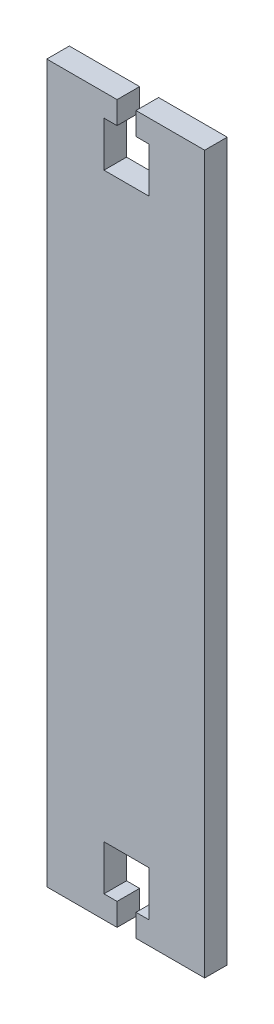
ISO-10303-21;
HEADER;
FILE_DESCRIPTION(('STEP AP214'),'2;1');
FILE_NAME('part.step','',(''),(''),'','','');
FILE_SCHEMA(('AUTOMOTIVE_DESIGN { 1 0 10303 214 1 1 1 1 }'));
ENDSEC;
DATA;
#1=APPLICATION_CONTEXT('core data for automotive mechanical design processes');
#2=APPLICATION_PROTOCOL_DEFINITION('international standard','automotive_design',2000,#1);
#3=PRODUCT_CONTEXT('',#1,'mechanical');
#4=PRODUCT('Part','Part','',(#3));
#5=PRODUCT_RELATED_PRODUCT_CATEGORY('part','',(#4));
#6=PRODUCT_DEFINITION_FORMATION('','',#4);
#7=PRODUCT_DEFINITION_CONTEXT('part definition',#1,'design');
#8=PRODUCT_DEFINITION('design','',#6,#7);
#9=PRODUCT_DEFINITION_SHAPE('','',#8);
#10=(LENGTH_UNIT() NAMED_UNIT(*) SI_UNIT(.MILLI.,.METRE.));
#11=(NAMED_UNIT(*) PLANE_ANGLE_UNIT() SI_UNIT($,.RADIAN.));
#12=(NAMED_UNIT(*) SI_UNIT($,.STERADIAN.) SOLID_ANGLE_UNIT());
#13=UNCERTAINTY_MEASURE_WITH_UNIT(LENGTH_MEASURE(1.E-05),#10,'distance_accuracy_value','');
#14=(GEOMETRIC_REPRESENTATION_CONTEXT(3) GLOBAL_UNCERTAINTY_ASSIGNED_CONTEXT((#13)) GLOBAL_UNIT_ASSIGNED_CONTEXT((#10,
#11,#12)) REPRESENTATION_CONTEXT('',''));
#15=CARTESIAN_POINT('',(0.,0.,0.));
#16=DIRECTION('',(0.,0.,1.));
#17=DIRECTION('',(1.,0.,0.));
#18=AXIS2_PLACEMENT_3D('',#15,#16,#17);
#19=CARTESIAN_POINT('',(0.,0.,5.));
#20=DIRECTION('',(1.,0.,0.));
#21=DIRECTION('',(0.,0.,-1.));
#22=AXIS2_PLACEMENT_3D('',#19,#20,#21);
#23=PLANE('',#22);
#24=DIRECTION('',(0.,-1.,0.));
#25=VECTOR('',#24,1.);
#26=CARTESIAN_POINT('',(0.,0.,0.));
#27=LINE('',#26,#25);
#28=CARTESIAN_POINT('',(0.,158.92,0.));
#29=VERTEX_POINT('',#28);
#30=CARTESIAN_POINT('',(0.,0.,0.));
#31=VERTEX_POINT('',#30);
#32=EDGE_CURVE('E208',#29,#31,#27,.T.);
#33=ORIENTED_EDGE('',*,*,#32,.T.);
#34=DIRECTION('',(0.,0.,-1.));
#35=VECTOR('',#34,1.);
#36=CARTESIAN_POINT('',(0.,0.,5.));
#37=LINE('',#36,#35);
#38=CARTESIAN_POINT('',(0.,0.,5.));
#39=VERTEX_POINT('',#38);
#40=EDGE_CURVE('E11',#39,#31,#37,.T.);
#41=ORIENTED_EDGE('',*,*,#40,.F.);
#42=DIRECTION('',(0.,-1.,0.));
#43=VECTOR('',#42,1.);
#44=CARTESIAN_POINT('',(0.,0.,5.));
#45=LINE('',#44,#43);
#46=CARTESIAN_POINT('',(0.,158.92,5.));
#47=VERTEX_POINT('',#46);
#48=EDGE_CURVE('E246',#47,#39,#45,.T.);
#49=ORIENTED_EDGE('',*,*,#48,.F.);
#50=DIRECTION('',(0.,0.,-1.));
#51=VECTOR('',#50,1.);
#52=CARTESIAN_POINT('',(0.,158.92,5.));
#53=LINE('',#52,#51);
#54=EDGE_CURVE('E204',#47,#29,#53,.T.);
#55=ORIENTED_EDGE('',*,*,#54,.T.);
#56=EDGE_LOOP('',(#33,#41,#49,#55));
#57=FACE_BOUND('',#56,.T.);
#58=ADVANCED_FACE('F40',(#57),#23,.F.);
#59=CARTESIAN_POINT('',(0.,0.,5.));
#60=DIRECTION('',(0.,1.,0.));
#61=DIRECTION('',(-1.,0.,0.));
#62=AXIS2_PLACEMENT_3D('',#59,#60,#61);
#63=PLANE('',#62);
#64=DIRECTION('',(1.,0.,0.));
#65=VECTOR('',#64,1.);
#66=CARTESIAN_POINT('',(0.,0.,0.));
#67=LINE('',#66,#65);
#68=CARTESIAN_POINT('',(15.58,0.,0.));
#69=VERTEX_POINT('',#68);
#70=EDGE_CURVE('E211',#31,#69,#67,.T.);
#71=ORIENTED_EDGE('',*,*,#70,.T.);
#72=DIRECTION('',(0.,0.,-1.));
#73=VECTOR('',#72,1.);
#74=CARTESIAN_POINT('',(15.58,0.,5.));
#75=LINE('',#74,#73);
#76=CARTESIAN_POINT('',(15.58,0.,5.));
#77=VERTEX_POINT('',#76);
#78=EDGE_CURVE('E48',#77,#69,#75,.T.);
#79=ORIENTED_EDGE('',*,*,#78,.F.);
#80=DIRECTION('',(1.,0.,0.));
#81=VECTOR('',#80,1.);
#82=CARTESIAN_POINT('',(0.,0.,5.));
#83=LINE('',#82,#81);
#84=EDGE_CURVE('E135',#39,#77,#83,.T.);
#85=ORIENTED_EDGE('',*,*,#84,.F.);
#86=ORIENTED_EDGE('',*,*,#40,.T.);
#87=EDGE_LOOP('',(#71,#79,#85,#86));
#88=FACE_BOUND('',#87,.T.);
#89=ADVANCED_FACE('F364',(#88),#63,.F.);
#90=CARTESIAN_POINT('',(15.58,0.,5.));
#91=DIRECTION('',(-1.,0.,0.));
#92=DIRECTION('',(0.,-1.,0.));
#93=AXIS2_PLACEMENT_3D('',#90,#91,#92);
#94=PLANE('',#93);
#95=DIRECTION('',(0.,1.,0.));
#96=VECTOR('',#95,1.);
#97=CARTESIAN_POINT('',(15.58,0.,0.));
#98=LINE('',#97,#96);
#99=CARTESIAN_POINT('',(15.58,5.,0.));
#100=VERTEX_POINT('',#99);
#101=EDGE_CURVE('E213',#69,#100,#98,.T.);
#102=ORIENTED_EDGE('',*,*,#101,.T.);
#103=DIRECTION('',(0.,0.,-1.));
#104=VECTOR('',#103,1.);
#105=CARTESIAN_POINT('',(15.58,5.,5.));
#106=LINE('',#105,#104);
#107=CARTESIAN_POINT('',(15.58,5.,5.));
#108=VERTEX_POINT('',#107);
#109=EDGE_CURVE('E289',#108,#100,#106,.T.);
#110=ORIENTED_EDGE('',*,*,#109,.F.);
#111=DIRECTION('',(0.,1.,0.));
#112=VECTOR('',#111,1.);
#113=CARTESIAN_POINT('',(15.58,0.,5.));
#114=LINE('',#113,#112);
#115=EDGE_CURVE('E297',#77,#108,#114,.T.);
#116=ORIENTED_EDGE('',*,*,#115,.F.);
#117=ORIENTED_EDGE('',*,*,#78,.T.);
#118=EDGE_LOOP('',(#102,#110,#116,#117));
#119=FACE_BOUND('',#118,.T.);
#120=ADVANCED_FACE('F295',(#119),#94,.F.);
#121=CARTESIAN_POINT('',(15.58,5.,5.));
#122=DIRECTION('',(0.,-1.,0.));
#123=DIRECTION('',(0.,0.,-1.));
#124=AXIS2_PLACEMENT_3D('',#121,#122,#123);
#125=PLANE('',#124);
#126=DIRECTION('',(-1.,0.,0.));
#127=VECTOR('',#126,1.);
#128=CARTESIAN_POINT('',(15.58,5.,0.));
#129=LINE('',#128,#127);
#130=CARTESIAN_POINT('',(12.68,5.,0.));
#131=VERTEX_POINT('',#130);
#132=EDGE_CURVE('E215',#100,#131,#129,.T.);
#133=ORIENTED_EDGE('',*,*,#132,.T.);
#134=DIRECTION('',(0.,0.,-1.));
#135=VECTOR('',#134,1.);
#136=CARTESIAN_POINT('',(12.68,5.,5.));
#137=LINE('',#136,#135);
#138=CARTESIAN_POINT('',(12.68,5.,5.));
#139=VERTEX_POINT('',#138);
#140=EDGE_CURVE('E286',#139,#131,#137,.T.);
#141=ORIENTED_EDGE('',*,*,#140,.F.);
#142=DIRECTION('',(-1.,0.,0.));
#143=VECTOR('',#142,1.);
#144=CARTESIAN_POINT('',(15.58,5.,5.));
#145=LINE('',#144,#143);
#146=EDGE_CURVE('E315',#108,#139,#145,.T.);
#147=ORIENTED_EDGE('',*,*,#146,.F.);
#148=ORIENTED_EDGE('',*,*,#109,.T.);
#149=EDGE_LOOP('',(#133,#141,#147,#148));
#150=FACE_BOUND('',#149,.T.);
#151=ADVANCED_FACE('F306',(#150),#125,.F.);
#152=CARTESIAN_POINT('',(12.68,5.,5.));
#153=DIRECTION('',(-1.,0.,0.));
#154=DIRECTION('',(0.,0.,1.));
#155=AXIS2_PLACEMENT_3D('',#152,#153,#154);
#156=PLANE('',#155);
#157=DIRECTION('',(0.,1.,0.));
#158=VECTOR('',#157,1.);
#159=CARTESIAN_POINT('',(12.68,5.,0.));
#160=LINE('',#159,#158);
#161=CARTESIAN_POINT('',(12.68,15.,0.));
#162=VERTEX_POINT('',#161);
#163=EDGE_CURVE('E217',#131,#162,#160,.T.);
#164=ORIENTED_EDGE('',*,*,#163,.T.);
#165=DIRECTION('',(0.,0.,-1.));
#166=VECTOR('',#165,1.);
#167=CARTESIAN_POINT('',(12.68,15.,5.));
#168=LINE('',#167,#166);
#169=CARTESIAN_POINT('',(12.68,15.,5.));
#170=VERTEX_POINT('',#169);
#171=EDGE_CURVE('E283',#170,#162,#168,.T.);
#172=ORIENTED_EDGE('',*,*,#171,.F.);
#173=DIRECTION('',(0.,1.,0.));
#174=VECTOR('',#173,1.);
#175=CARTESIAN_POINT('',(12.68,5.,5.));
#176=LINE('',#175,#174);
#177=EDGE_CURVE('E312',#139,#170,#176,.T.);
#178=ORIENTED_EDGE('',*,*,#177,.F.);
#179=ORIENTED_EDGE('',*,*,#140,.T.);
#180=EDGE_LOOP('',(#164,#172,#178,#179));
#181=FACE_BOUND('',#180,.T.);
#182=ADVANCED_FACE('F310',(#181),#156,.F.);
#183=CARTESIAN_POINT('',(12.68,15.,5.));
#184=DIRECTION('',(0.,1.,0.));
#185=DIRECTION('',(0.,0.,1.));
#186=AXIS2_PLACEMENT_3D('',#183,#184,#185);
#187=PLANE('',#186);
#188=DIRECTION('',(1.,0.,0.));
#189=VECTOR('',#188,1.);
#190=CARTESIAN_POINT('',(12.68,15.,0.));
#191=LINE('',#190,#189);
#192=CARTESIAN_POINT('',(22.68,15.,0.));
#193=VERTEX_POINT('',#192);
#194=EDGE_CURVE('E219',#162,#193,#191,.T.);
#195=ORIENTED_EDGE('',*,*,#194,.T.);
#196=DIRECTION('',(0.,0.,-1.));
#197=VECTOR('',#196,1.);
#198=CARTESIAN_POINT('',(22.68,15.,5.));
#199=LINE('',#198,#197);
#200=CARTESIAN_POINT('',(22.68,15.,5.));
#201=VERTEX_POINT('',#200);
#202=EDGE_CURVE('E280',#201,#193,#199,.T.);
#203=ORIENTED_EDGE('',*,*,#202,.F.);
#204=DIRECTION('',(1.,0.,0.));
#205=VECTOR('',#204,1.);
#206=CARTESIAN_POINT('',(12.68,15.,5.));
#207=LINE('',#206,#205);
#208=EDGE_CURVE('E314',#170,#201,#207,.T.);
#209=ORIENTED_EDGE('',*,*,#208,.F.);
#210=ORIENTED_EDGE('',*,*,#171,.T.);
#211=EDGE_LOOP('',(#195,#203,#209,#210));
#212=FACE_BOUND('',#211,.T.);
#213=ADVANCED_FACE('F377',(#212),#187,.F.);
#214=CARTESIAN_POINT('',(22.68,15.,5.));
#215=DIRECTION('',(1.,0.,0.));
#216=DIRECTION('',(0.,0.,-1.));
#217=AXIS2_PLACEMENT_3D('',#214,#215,#216);
#218=PLANE('',#217);
#219=DIRECTION('',(0.,-1.,0.));
#220=VECTOR('',#219,1.);
#221=CARTESIAN_POINT('',(22.68,15.,0.));
#222=LINE('',#221,#220);
#223=CARTESIAN_POINT('',(22.68,5.,0.));
#224=VERTEX_POINT('',#223);
#225=EDGE_CURVE('E221',#193,#224,#222,.T.);
#226=ORIENTED_EDGE('',*,*,#225,.T.);
#227=DIRECTION('',(0.,0.,-1.));
#228=VECTOR('',#227,1.);
#229=CARTESIAN_POINT('',(22.68,5.,5.));
#230=LINE('',#229,#228);
#231=CARTESIAN_POINT('',(22.68,5.,5.));
#232=VERTEX_POINT('',#231);
#233=EDGE_CURVE('E277',#232,#224,#230,.T.);
#234=ORIENTED_EDGE('',*,*,#233,.F.);
#235=DIRECTION('',(0.,-1.,0.));
#236=VECTOR('',#235,1.);
#237=CARTESIAN_POINT('',(22.68,15.,5.));
#238=LINE('',#237,#236);
#239=EDGE_CURVE('E317',#201,#232,#238,.T.);
#240=ORIENTED_EDGE('',*,*,#239,.F.);
#241=ORIENTED_EDGE('',*,*,#202,.T.);
#242=EDGE_LOOP('',(#226,#234,#240,#241));
#243=FACE_BOUND('',#242,.T.);
#244=ADVANCED_FACE('F380',(#243),#218,.F.);
#245=CARTESIAN_POINT('',(22.68,5.,5.));
#246=DIRECTION('',(0.,-1.,0.));
#247=DIRECTION('',(0.,0.,-1.));
#248=AXIS2_PLACEMENT_3D('',#245,#246,#247);
#249=PLANE('',#248);
#250=DIRECTION('',(-1.,0.,0.));
#251=VECTOR('',#250,1.);
#252=CARTESIAN_POINT('',(22.68,5.,0.));
#253=LINE('',#252,#251);
#254=CARTESIAN_POINT('',(19.78,5.,0.));
#255=VERTEX_POINT('',#254);
#256=EDGE_CURVE('E223',#224,#255,#253,.T.);
#257=ORIENTED_EDGE('',*,*,#256,.T.);
#258=DIRECTION('',(0.,0.,-1.));
#259=VECTOR('',#258,1.);
#260=CARTESIAN_POINT('',(19.78,5.,5.));
#261=LINE('',#260,#259);
#262=CARTESIAN_POINT('',(19.78,5.,5.));
#263=VERTEX_POINT('',#262);
#264=EDGE_CURVE('E274',#263,#255,#261,.T.);
#265=ORIENTED_EDGE('',*,*,#264,.F.);
#266=DIRECTION('',(-1.,0.,0.));
#267=VECTOR('',#266,1.);
#268=CARTESIAN_POINT('',(22.68,5.,5.));
#269=LINE('',#268,#267);
#270=EDGE_CURVE('E323',#232,#263,#269,.T.);
#271=ORIENTED_EDGE('',*,*,#270,.F.);
#272=ORIENTED_EDGE('',*,*,#233,.T.);
#273=EDGE_LOOP('',(#257,#265,#271,#272));
#274=FACE_BOUND('',#273,.T.);
#275=ADVANCED_FACE('F384',(#274),#249,.F.);
#276=CARTESIAN_POINT('',(19.78,5.,5.));
#277=DIRECTION('',(1.,0.,0.));
#278=DIRECTION('',(0.,0.,-1.));
#279=AXIS2_PLACEMENT_3D('',#276,#277,#278);
#280=PLANE('',#279);
#281=DIRECTION('',(0.,-1.,0.));
#282=VECTOR('',#281,1.);
#283=CARTESIAN_POINT('',(19.78,5.,0.));
#284=LINE('',#283,#282);
#285=CARTESIAN_POINT('',(19.78,0.,0.));
#286=VERTEX_POINT('',#285);
#287=EDGE_CURVE('E225',#255,#286,#284,.T.);
#288=ORIENTED_EDGE('',*,*,#287,.T.);
#289=DIRECTION('',(0.,0.,-1.));
#290=VECTOR('',#289,1.);
#291=CARTESIAN_POINT('',(19.78,0.,5.));
#292=LINE('',#291,#290);
#293=CARTESIAN_POINT('',(19.78,0.,5.));
#294=VERTEX_POINT('',#293);
#295=EDGE_CURVE('E271',#294,#286,#292,.T.);
#296=ORIENTED_EDGE('',*,*,#295,.F.);
#297=DIRECTION('',(0.,-1.,0.));
#298=VECTOR('',#297,1.);
#299=CARTESIAN_POINT('',(19.78,5.,5.));
#300=LINE('',#299,#298);
#301=EDGE_CURVE('E325',#263,#294,#300,.T.);
#302=ORIENTED_EDGE('',*,*,#301,.F.);
#303=ORIENTED_EDGE('',*,*,#264,.T.);
#304=EDGE_LOOP('',(#288,#296,#302,#303));
#305=FACE_BOUND('',#304,.T.);
#306=ADVANCED_FACE('F388',(#305),#280,.F.);
#307=CARTESIAN_POINT('',(19.78,0.,5.));
#308=DIRECTION('',(0.,1.,0.));
#309=DIRECTION('',(-1.,0.,0.));
#310=AXIS2_PLACEMENT_3D('',#307,#308,#309);
#311=PLANE('',#310);
#312=DIRECTION('',(1.,0.,0.));
#313=VECTOR('',#312,1.);
#314=CARTESIAN_POINT('',(19.78,0.,0.));
#315=LINE('',#314,#313);
#316=CARTESIAN_POINT('',(35.,0.,0.));
#317=VERTEX_POINT('',#316);
#318=EDGE_CURVE('E227',#286,#317,#315,.T.);
#319=ORIENTED_EDGE('',*,*,#318,.T.);
#320=DIRECTION('',(0.,0.,-1.));
#321=VECTOR('',#320,1.);
#322=CARTESIAN_POINT('',(35.,0.,5.));
#323=LINE('',#322,#321);
#324=CARTESIAN_POINT('',(35.,0.,5.));
#325=VERTEX_POINT('',#324);
#326=EDGE_CURVE('E268',#325,#317,#323,.T.);
#327=ORIENTED_EDGE('',*,*,#326,.F.);
#328=DIRECTION('',(1.,0.,0.));
#329=VECTOR('',#328,1.);
#330=CARTESIAN_POINT('',(19.78,0.,5.));
#331=LINE('',#330,#329);
#332=EDGE_CURVE('E327',#294,#325,#331,.T.);
#333=ORIENTED_EDGE('',*,*,#332,.F.);
#334=ORIENTED_EDGE('',*,*,#295,.T.);
#335=EDGE_LOOP('',(#319,#327,#333,#334));
#336=FACE_BOUND('',#335,.T.);
#337=ADVANCED_FACE('F392',(#336),#311,.F.);
#338=CARTESIAN_POINT('',(35.,0.,5.));
#339=DIRECTION('',(-1.,0.,0.));
#340=DIRECTION('',(0.,0.,1.));
#341=AXIS2_PLACEMENT_3D('',#338,#339,#340);
#342=PLANE('',#341);
#343=DIRECTION('',(0.,1.,0.));
#344=VECTOR('',#343,1.);
#345=CARTESIAN_POINT('',(35.,0.,0.));
#346=LINE('',#345,#344);
#347=CARTESIAN_POINT('',(35.,158.92,0.));
#348=VERTEX_POINT('',#347);
#349=EDGE_CURVE('E229',#317,#348,#346,.T.);
#350=ORIENTED_EDGE('',*,*,#349,.T.);
#351=DIRECTION('',(0.,0.,-1.));
#352=VECTOR('',#351,1.);
#353=CARTESIAN_POINT('',(35.,158.92,5.));
#354=LINE('',#353,#352);
#355=CARTESIAN_POINT('',(35.,158.92,5.));
#356=VERTEX_POINT('',#355);
#357=EDGE_CURVE('E265',#356,#348,#354,.T.);
#358=ORIENTED_EDGE('',*,*,#357,.F.);
#359=DIRECTION('',(0.,1.,0.));
#360=VECTOR('',#359,1.);
#361=CARTESIAN_POINT('',(35.,0.,5.));
#362=LINE('',#361,#360);
#363=EDGE_CURVE('E329',#325,#356,#362,.T.);
#364=ORIENTED_EDGE('',*,*,#363,.F.);
#365=ORIENTED_EDGE('',*,*,#326,.T.);
#366=EDGE_LOOP('',(#350,#358,#364,#365));
#367=FACE_BOUND('',#366,.T.);
#368=ADVANCED_FACE('F396',(#367),#342,.F.);
#369=CARTESIAN_POINT('',(19.7800000000001,158.92,5.));
#370=DIRECTION('',(0.,-1.,0.));
#371=DIRECTION('',(0.,0.,-1.));
#372=AXIS2_PLACEMENT_3D('',#369,#370,#371);
#373=PLANE('',#372);
#374=DIRECTION('',(-1.,0.,0.));
#375=VECTOR('',#374,1.);
#376=CARTESIAN_POINT('',(19.7800000000001,158.92,0.));
#377=LINE('',#376,#375);
#378=CARTESIAN_POINT('',(19.7800000000001,158.92,0.));
#379=VERTEX_POINT('',#378);
#380=EDGE_CURVE('E231',#348,#379,#377,.T.);
#381=ORIENTED_EDGE('',*,*,#380,.T.);
#382=DIRECTION('',(0.,0.,-1.));
#383=VECTOR('',#382,1.);
#384=CARTESIAN_POINT('',(19.7800000000001,158.92,5.));
#385=LINE('',#384,#383);
#386=CARTESIAN_POINT('',(19.7800000000001,158.92,5.));
#387=VERTEX_POINT('',#386);
#388=EDGE_CURVE('E262',#387,#379,#385,.T.);
#389=ORIENTED_EDGE('',*,*,#388,.F.);
#390=DIRECTION('',(-1.,0.,0.));
#391=VECTOR('',#390,1.);
#392=CARTESIAN_POINT('',(19.7800000000001,158.92,5.));
#393=LINE('',#392,#391);
#394=EDGE_CURVE('E331',#356,#387,#393,.T.);
#395=ORIENTED_EDGE('',*,*,#394,.F.);
#396=ORIENTED_EDGE('',*,*,#357,.T.);
#397=EDGE_LOOP('',(#381,#389,#395,#396));
#398=FACE_BOUND('',#397,.T.);
#399=ADVANCED_FACE('F400',(#398),#373,.F.);
#400=CARTESIAN_POINT('',(19.7800000000001,153.92,5.));
#401=DIRECTION('',(1.,0.,0.));
#402=DIRECTION('',(0.,0.,-1.));
#403=AXIS2_PLACEMENT_3D('',#400,#401,#402);
#404=PLANE('',#403);
#405=DIRECTION('',(0.,-1.,0.));
#406=VECTOR('',#405,1.);
#407=CARTESIAN_POINT('',(19.7800000000001,153.92,0.));
#408=LINE('',#407,#406);
#409=CARTESIAN_POINT('',(19.7800000000001,153.92,0.));
#410=VERTEX_POINT('',#409);
#411=EDGE_CURVE('E233',#379,#410,#408,.T.);
#412=ORIENTED_EDGE('',*,*,#411,.T.);
#413=DIRECTION('',(0.,0.,-1.));
#414=VECTOR('',#413,1.);
#415=CARTESIAN_POINT('',(19.7800000000001,153.92,5.));
#416=LINE('',#415,#414);
#417=CARTESIAN_POINT('',(19.7800000000001,153.92,5.));
#418=VERTEX_POINT('',#417);
#419=EDGE_CURVE('E259',#418,#410,#416,.T.);
#420=ORIENTED_EDGE('',*,*,#419,.F.);
#421=DIRECTION('',(0.,-1.,0.));
#422=VECTOR('',#421,1.);
#423=CARTESIAN_POINT('',(19.7800000000001,153.92,5.));
#424=LINE('',#423,#422);
#425=EDGE_CURVE('E333',#387,#418,#424,.T.);
#426=ORIENTED_EDGE('',*,*,#425,.F.);
#427=ORIENTED_EDGE('',*,*,#388,.T.);
#428=EDGE_LOOP('',(#412,#420,#426,#427));
#429=FACE_BOUND('',#428,.T.);
#430=ADVANCED_FACE('F404',(#429),#404,.F.);
#431=CARTESIAN_POINT('',(22.68,153.92,5.));
#432=DIRECTION('',(0.,1.,0.));
#433=DIRECTION('',(0.,0.,1.));
#434=AXIS2_PLACEMENT_3D('',#431,#432,#433);
#435=PLANE('',#434);
#436=DIRECTION('',(1.,0.,0.));
#437=VECTOR('',#436,1.);
#438=CARTESIAN_POINT('',(22.68,153.92,0.));
#439=LINE('',#438,#437);
#440=CARTESIAN_POINT('',(22.68,153.92,0.));
#441=VERTEX_POINT('',#440);
#442=EDGE_CURVE('E235',#410,#441,#439,.T.);
#443=ORIENTED_EDGE('',*,*,#442,.T.);
#444=DIRECTION('',(0.,0.,-1.));
#445=VECTOR('',#444,1.);
#446=CARTESIAN_POINT('',(22.68,153.92,5.));
#447=LINE('',#446,#445);
#448=CARTESIAN_POINT('',(22.68,153.92,5.));
#449=VERTEX_POINT('',#448);
#450=EDGE_CURVE('E256',#449,#441,#447,.T.);
#451=ORIENTED_EDGE('',*,*,#450,.F.);
#452=DIRECTION('',(1.,0.,0.));
#453=VECTOR('',#452,1.);
#454=CARTESIAN_POINT('',(22.68,153.92,5.));
#455=LINE('',#454,#453);
#456=EDGE_CURVE('E335',#418,#449,#455,.T.);
#457=ORIENTED_EDGE('',*,*,#456,.F.);
#458=ORIENTED_EDGE('',*,*,#419,.T.);
#459=EDGE_LOOP('',(#443,#451,#457,#458));
#460=FACE_BOUND('',#459,.T.);
#461=ADVANCED_FACE('F408',(#460),#435,.F.);
#462=CARTESIAN_POINT('',(22.68,143.92,5.));
#463=DIRECTION('',(1.,0.,0.));
#464=DIRECTION('',(0.,0.,-1.));
#465=AXIS2_PLACEMENT_3D('',#462,#463,#464);
#466=PLANE('',#465);
#467=DIRECTION('',(0.,-1.,0.));
#468=VECTOR('',#467,1.);
#469=CARTESIAN_POINT('',(22.68,143.92,0.));
#470=LINE('',#469,#468);
#471=CARTESIAN_POINT('',(22.68,143.92,0.));
#472=VERTEX_POINT('',#471);
#473=EDGE_CURVE('E237',#441,#472,#470,.T.);
#474=ORIENTED_EDGE('',*,*,#473,.T.);
#475=DIRECTION('',(0.,0.,-1.));
#476=VECTOR('',#475,1.);
#477=CARTESIAN_POINT('',(22.68,143.92,5.));
#478=LINE('',#477,#476);
#479=CARTESIAN_POINT('',(22.68,143.92,5.));
#480=VERTEX_POINT('',#479);
#481=EDGE_CURVE('E253',#480,#472,#478,.T.);
#482=ORIENTED_EDGE('',*,*,#481,.F.);
#483=DIRECTION('',(0.,-1.,0.));
#484=VECTOR('',#483,1.);
#485=CARTESIAN_POINT('',(22.68,143.92,5.));
#486=LINE('',#485,#484);
#487=EDGE_CURVE('E337',#449,#480,#486,.T.);
#488=ORIENTED_EDGE('',*,*,#487,.F.);
#489=ORIENTED_EDGE('',*,*,#450,.T.);
#490=EDGE_LOOP('',(#474,#482,#488,#489));
#491=FACE_BOUND('',#490,.T.);
#492=ADVANCED_FACE('F412',(#491),#466,.F.);
#493=CARTESIAN_POINT('',(12.68,143.92,5.));
#494=DIRECTION('',(0.,-1.,0.));
#495=DIRECTION('',(0.,0.,-1.));
#496=AXIS2_PLACEMENT_3D('',#493,#494,#495);
#497=PLANE('',#496);
#498=DIRECTION('',(-1.,0.,0.));
#499=VECTOR('',#498,1.);
#500=CARTESIAN_POINT('',(12.68,143.92,0.));
#501=LINE('',#500,#499);
#502=CARTESIAN_POINT('',(12.68,143.92,0.));
#503=VERTEX_POINT('',#502);
#504=EDGE_CURVE('E239',#472,#503,#501,.T.);
#505=ORIENTED_EDGE('',*,*,#504,.T.);
#506=DIRECTION('',(0.,0.,-1.));
#507=VECTOR('',#506,1.);
#508=CARTESIAN_POINT('',(12.68,143.92,5.));
#509=LINE('',#508,#507);
#510=CARTESIAN_POINT('',(12.68,143.92,5.));
#511=VERTEX_POINT('',#510);
#512=EDGE_CURVE('E250',#511,#503,#509,.T.);
#513=ORIENTED_EDGE('',*,*,#512,.F.);
#514=DIRECTION('',(-1.,0.,0.));
#515=VECTOR('',#514,1.);
#516=CARTESIAN_POINT('',(12.68,143.92,5.));
#517=LINE('',#516,#515);
#518=EDGE_CURVE('E339',#480,#511,#517,.T.);
#519=ORIENTED_EDGE('',*,*,#518,.F.);
#520=ORIENTED_EDGE('',*,*,#481,.T.);
#521=EDGE_LOOP('',(#505,#513,#519,#520));
#522=FACE_BOUND('',#521,.T.);
#523=ADVANCED_FACE('F345',(#522),#497,.F.);
#524=CARTESIAN_POINT('',(12.68,153.92,5.));
#525=DIRECTION('',(-1.,0.,0.));
#526=DIRECTION('',(0.,0.,1.));
#527=AXIS2_PLACEMENT_3D('',#524,#525,#526);
#528=PLANE('',#527);
#529=DIRECTION('',(0.,1.,0.));
#530=VECTOR('',#529,1.);
#531=CARTESIAN_POINT('',(12.68,153.92,0.));
#532=LINE('',#531,#530);
#533=CARTESIAN_POINT('',(12.68,153.92,0.));
#534=VERTEX_POINT('',#533);
#535=EDGE_CURVE('E241',#503,#534,#532,.T.);
#536=ORIENTED_EDGE('',*,*,#535,.T.);
#537=DIRECTION('',(0.,0.,-1.));
#538=VECTOR('',#537,1.);
#539=CARTESIAN_POINT('',(12.68,153.92,5.));
#540=LINE('',#539,#538);
#541=CARTESIAN_POINT('',(12.68,153.92,5.));
#542=VERTEX_POINT('',#541);
#543=EDGE_CURVE('E199',#542,#534,#540,.T.);
#544=ORIENTED_EDGE('',*,*,#543,.F.);
#545=DIRECTION('',(0.,1.,0.));
#546=VECTOR('',#545,1.);
#547=CARTESIAN_POINT('',(12.68,153.92,5.));
#548=LINE('',#547,#546);
#549=EDGE_CURVE('E190',#511,#542,#548,.T.);
#550=ORIENTED_EDGE('',*,*,#549,.F.);
#551=ORIENTED_EDGE('',*,*,#512,.T.);
#552=EDGE_LOOP('',(#536,#544,#550,#551));
#553=FACE_BOUND('',#552,.T.);
#554=ADVANCED_FACE('F349',(#553),#528,.F.);
#555=CARTESIAN_POINT('',(15.58,153.92,5.));
#556=DIRECTION('',(0.,1.,0.));
#557=DIRECTION('',(0.,0.,1.));
#558=AXIS2_PLACEMENT_3D('',#555,#556,#557);
#559=PLANE('',#558);
#560=DIRECTION('',(1.,0.,0.));
#561=VECTOR('',#560,1.);
#562=CARTESIAN_POINT('',(15.58,153.92,0.));
#563=LINE('',#562,#561);
#564=CARTESIAN_POINT('',(15.58,153.92,0.));
#565=VERTEX_POINT('',#564);
#566=EDGE_CURVE('E198',#534,#565,#563,.T.);
#567=ORIENTED_EDGE('',*,*,#566,.T.);
#568=DIRECTION('',(0.,0.,-1.));
#569=VECTOR('',#568,1.);
#570=CARTESIAN_POINT('',(15.58,153.92,5.));
#571=LINE('',#570,#569);
#572=CARTESIAN_POINT('',(15.58,153.92,5.));
#573=VERTEX_POINT('',#572);
#574=EDGE_CURVE('E195',#573,#565,#571,.T.);
#575=ORIENTED_EDGE('',*,*,#574,.F.);
#576=DIRECTION('',(1.,0.,0.));
#577=VECTOR('',#576,1.);
#578=CARTESIAN_POINT('',(15.58,153.92,5.));
#579=LINE('',#578,#577);
#580=EDGE_CURVE('E184',#542,#573,#579,.T.);
#581=ORIENTED_EDGE('',*,*,#580,.F.);
#582=ORIENTED_EDGE('',*,*,#543,.T.);
#583=EDGE_LOOP('',(#567,#575,#581,#582));
#584=FACE_BOUND('',#583,.T.);
#585=ADVANCED_FACE('F196',(#584),#559,.F.);
#586=CARTESIAN_POINT('',(15.58,158.92,5.));
#587=DIRECTION('',(-1.,0.,0.));
#588=DIRECTION('',(0.,0.,1.));
#589=AXIS2_PLACEMENT_3D('',#586,#587,#588);
#590=PLANE('',#589);
#591=DIRECTION('',(0.,1.,0.));
#592=VECTOR('',#591,1.);
#593=CARTESIAN_POINT('',(15.58,158.92,0.));
#594=LINE('',#593,#592);
#595=CARTESIAN_POINT('',(15.58,158.92,0.));
#596=VERTEX_POINT('',#595);
#597=EDGE_CURVE('E121',#565,#596,#594,.T.);
#598=ORIENTED_EDGE('',*,*,#597,.T.);
#599=DIRECTION('',(0.,0.,-1.));
#600=VECTOR('',#599,1.);
#601=CARTESIAN_POINT('',(15.58,158.92,5.));
#602=LINE('',#601,#600);
#603=CARTESIAN_POINT('',(15.58,158.92,5.));
#604=VERTEX_POINT('',#603);
#605=EDGE_CURVE('E200',#604,#596,#602,.T.);
#606=ORIENTED_EDGE('',*,*,#605,.F.);
#607=DIRECTION('',(0.,1.,0.));
#608=VECTOR('',#607,1.);
#609=CARTESIAN_POINT('',(15.58,158.92,5.));
#610=LINE('',#609,#608);
#611=EDGE_CURVE('E188',#573,#604,#610,.T.);
#612=ORIENTED_EDGE('',*,*,#611,.F.);
#613=ORIENTED_EDGE('',*,*,#574,.T.);
#614=EDGE_LOOP('',(#598,#606,#612,#613));
#615=FACE_BOUND('',#614,.T.);
#616=ADVANCED_FACE('F202',(#615),#590,.F.);
#617=CARTESIAN_POINT('',(0.,158.92,5.));
#618=DIRECTION('',(0.,-1.,0.));
#619=DIRECTION('',(0.,0.,-1.));
#620=AXIS2_PLACEMENT_3D('',#617,#618,#619);
#621=PLANE('',#620);
#622=DIRECTION('',(-1.,0.,0.));
#623=VECTOR('',#622,1.);
#624=CARTESIAN_POINT('',(0.,158.92,0.));
#625=LINE('',#624,#623);
#626=EDGE_CURVE('E127',#596,#29,#625,.T.);
#627=ORIENTED_EDGE('',*,*,#626,.T.);
#628=ORIENTED_EDGE('',*,*,#54,.F.);
#629=DIRECTION('',(-1.,0.,0.));
#630=VECTOR('',#629,1.);
#631=CARTESIAN_POINT('',(0.,158.92,5.));
#632=LINE('',#631,#630);
#633=EDGE_CURVE('E56',#604,#47,#632,.T.);
#634=ORIENTED_EDGE('',*,*,#633,.F.);
#635=ORIENTED_EDGE('',*,*,#605,.T.);
#636=EDGE_LOOP('',(#627,#628,#634,#635));
#637=FACE_BOUND('',#636,.T.);
#638=ADVANCED_FACE('F353',(#637),#621,.F.);
#639=CARTESIAN_POINT('',(0.,0.,5.));
#640=DIRECTION('',(0.,0.,-1.));
#641=DIRECTION('',(-1.,0.,0.));
#642=AXIS2_PLACEMENT_3D('',#639,#640,#641);
#643=PLANE('',#642);
#644=ORIENTED_EDGE('',*,*,#48,.T.);
#645=ORIENTED_EDGE('',*,*,#84,.T.);
#646=ORIENTED_EDGE('',*,*,#115,.T.);
#647=ORIENTED_EDGE('',*,*,#146,.T.);
#648=ORIENTED_EDGE('',*,*,#177,.T.);
#649=ORIENTED_EDGE('',*,*,#208,.T.);
#650=ORIENTED_EDGE('',*,*,#239,.T.);
#651=ORIENTED_EDGE('',*,*,#270,.T.);
#652=ORIENTED_EDGE('',*,*,#301,.T.);
#653=ORIENTED_EDGE('',*,*,#332,.T.);
#654=ORIENTED_EDGE('',*,*,#363,.T.);
#655=ORIENTED_EDGE('',*,*,#394,.T.);
#656=ORIENTED_EDGE('',*,*,#425,.T.);
#657=ORIENTED_EDGE('',*,*,#456,.T.);
#658=ORIENTED_EDGE('',*,*,#487,.T.);
#659=ORIENTED_EDGE('',*,*,#518,.T.);
#660=ORIENTED_EDGE('',*,*,#549,.T.);
#661=ORIENTED_EDGE('',*,*,#580,.T.);
#662=ORIENTED_EDGE('',*,*,#611,.T.);
#663=ORIENTED_EDGE('',*,*,#633,.T.);
#664=EDGE_LOOP('',(#644,#645,#646,#647,#648,#649,#650,#651,#652,#653,#654,#655,#656,#657,#658,
#659,#660,#661,#662,#663));
#665=FACE_BOUND('',#664,.T.);
#666=ADVANCED_FACE('F186',(#665),#643,.F.);
#667=CARTESIAN_POINT('',(0.,0.,0.));
#668=DIRECTION('',(0.,0.,-1.));
#669=DIRECTION('',(-1.,0.,0.));
#670=AXIS2_PLACEMENT_3D('',#667,#668,#669);
#671=PLANE('',#670);
#672=ORIENTED_EDGE('',*,*,#32,.F.);
#673=ORIENTED_EDGE('',*,*,#626,.F.);
#674=ORIENTED_EDGE('',*,*,#597,.F.);
#675=ORIENTED_EDGE('',*,*,#566,.F.);
#676=ORIENTED_EDGE('',*,*,#535,.F.);
#677=ORIENTED_EDGE('',*,*,#504,.F.);
#678=ORIENTED_EDGE('',*,*,#473,.F.);
#679=ORIENTED_EDGE('',*,*,#442,.F.);
#680=ORIENTED_EDGE('',*,*,#411,.F.);
#681=ORIENTED_EDGE('',*,*,#380,.F.);
#682=ORIENTED_EDGE('',*,*,#349,.F.);
#683=ORIENTED_EDGE('',*,*,#318,.F.);
#684=ORIENTED_EDGE('',*,*,#287,.F.);
#685=ORIENTED_EDGE('',*,*,#256,.F.);
#686=ORIENTED_EDGE('',*,*,#225,.F.);
#687=ORIENTED_EDGE('',*,*,#194,.F.);
#688=ORIENTED_EDGE('',*,*,#163,.F.);
#689=ORIENTED_EDGE('',*,*,#132,.F.);
#690=ORIENTED_EDGE('',*,*,#101,.F.);
#691=ORIENTED_EDGE('',*,*,#70,.F.);
#692=EDGE_LOOP('',(#672,#673,#674,#675,#676,#677,#678,#679,#680,#681,#682,#683,#684,#685,#686,
#687,#688,#689,#690,#691));
#693=FACE_BOUND('',#692,.T.);
#694=ADVANCED_FACE('F301',(#693),#671,.T.);
#695=CLOSED_SHELL('',(#58,#89,#120,#151,#182,#213,#244,#275,#306,#337,#368,#399,#430,#461,#492,
#523,#554,#585,#616,#638,#666,#694));
#696=MANIFOLD_SOLID_BREP('B2',#695);
#697=ADVANCED_BREP_SHAPE_REPRESENTATION('',(#18,#696),#14);
#698=SHAPE_DEFINITION_REPRESENTATION(#9,#697);
ENDSEC;
END-ISO-10303-21;
